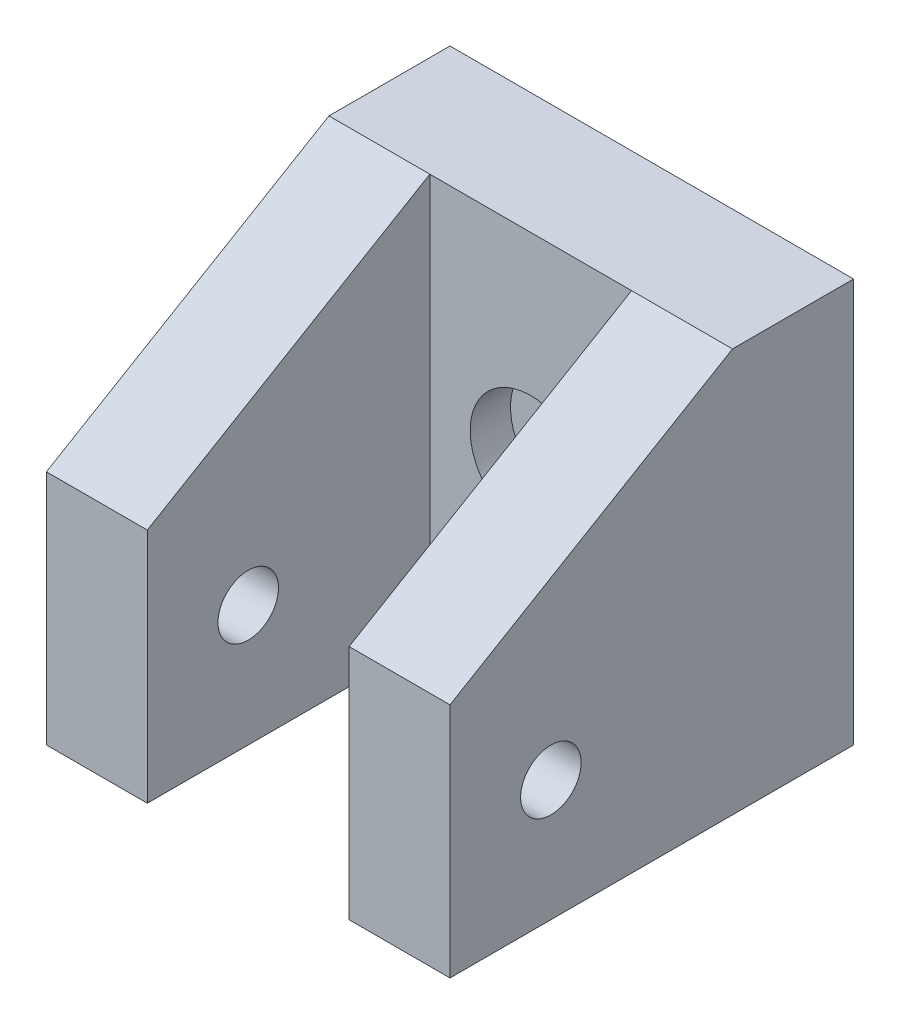
ISO-10303-21;
HEADER;
FILE_DESCRIPTION(('STEP AP214'),'2;1');
FILE_NAME('part.step','',(''),(''),'','','');
FILE_SCHEMA(('AUTOMOTIVE_DESIGN { 1 0 10303 214 1 1 1 1 }'));
ENDSEC;
DATA;
#1=APPLICATION_CONTEXT('core data for automotive mechanical design processes');
#2=APPLICATION_PROTOCOL_DEFINITION('international standard','automotive_design',2000,#1);
#3=PRODUCT_CONTEXT('',#1,'mechanical');
#4=PRODUCT('Part','Part','',(#3));
#5=PRODUCT_RELATED_PRODUCT_CATEGORY('part','',(#4));
#6=PRODUCT_DEFINITION_FORMATION('','',#4);
#7=PRODUCT_DEFINITION_CONTEXT('part definition',#1,'design');
#8=PRODUCT_DEFINITION('design','',#6,#7);
#9=PRODUCT_DEFINITION_SHAPE('','',#8);
#10=(LENGTH_UNIT() NAMED_UNIT(*) SI_UNIT(.MILLI.,.METRE.));
#11=(NAMED_UNIT(*) PLANE_ANGLE_UNIT() SI_UNIT($,.RADIAN.));
#12=(NAMED_UNIT(*) SI_UNIT($,.STERADIAN.) SOLID_ANGLE_UNIT());
#13=UNCERTAINTY_MEASURE_WITH_UNIT(LENGTH_MEASURE(1.E-05),#10,'distance_accuracy_value','');
#14=(GEOMETRIC_REPRESENTATION_CONTEXT(3) GLOBAL_UNCERTAINTY_ASSIGNED_CONTEXT((#13)) GLOBAL_UNIT_ASSIGNED_CONTEXT((#10,
#11,#12)) REPRESENTATION_CONTEXT('',''));
#15=CARTESIAN_POINT('',(0.,0.,0.));
#16=DIRECTION('',(0.,0.,1.));
#17=DIRECTION('',(1.,0.,0.));
#18=AXIS2_PLACEMENT_3D('',#15,#16,#17);
#19=CARTESIAN_POINT('',(10.,10.,0.));
#20=DIRECTION('',(0.,0.,1.));
#21=DIRECTION('',(1.,0.,0.));
#22=AXIS2_PLACEMENT_3D('',#19,#20,#21);
#23=CYLINDRICAL_SURFACE('',#22,1.6);
#24=CARTESIAN_POINT('',(10.,10.,0.));
#25=DIRECTION('',(0.,0.,1.));
#26=DIRECTION('',(1.,0.,0.));
#27=AXIS2_PLACEMENT_3D('',#24,#25,#26);
#28=CIRCLE('',#27,1.6);
#29=CARTESIAN_POINT('',(11.6,10.,0.));
#30=VERTEX_POINT('',#29);
#31=EDGE_CURVE('E156',#30,#30,#28,.T.);
#32=ORIENTED_EDGE('',*,*,#31,.F.);
#33=EDGE_LOOP('',(#32));
#34=FACE_BOUND('',#33,.T.);
#35=CARTESIAN_POINT('',(10.,10.,4.));
#36=DIRECTION('',(0.,0.,1.));
#37=DIRECTION('',(1.,0.,0.));
#38=AXIS2_PLACEMENT_3D('',#35,#36,#37);
#39=CIRCLE('',#38,1.6);
#40=CARTESIAN_POINT('',(11.6,10.,4.));
#41=VERTEX_POINT('',#40);
#42=EDGE_CURVE('E154',#41,#41,#39,.F.);
#43=ORIENTED_EDGE('',*,*,#42,.F.);
#44=EDGE_LOOP('',(#43));
#45=FACE_BOUND('',#44,.T.);
#46=ADVANCED_FACE('F35',(#34,#45),#23,.F.);
#47=CARTESIAN_POINT('',(0.,0.,20.));
#48=DIRECTION('',(0.,0.,-1.));
#49=DIRECTION('',(-1.,0.,0.));
#50=AXIS2_PLACEMENT_3D('',#47,#48,#49);
#51=PLANE('',#50);
#52=DIRECTION('',(0.,-1.,0.));
#53=VECTOR('',#52,1.);
#54=CARTESIAN_POINT('',(5.,20.,20.));
#55=LINE('',#54,#53);
#56=CARTESIAN_POINT('',(5.,11.7258345510811,20.));
#57=VERTEX_POINT('',#56);
#58=CARTESIAN_POINT('',(5.,0.,20.));
#59=VERTEX_POINT('',#58);
#60=EDGE_CURVE('E123',#57,#59,#55,.T.);
#61=ORIENTED_EDGE('',*,*,#60,.F.);
#62=DIRECTION('',(1.,0.,0.));
#63=VECTOR('',#62,1.);
#64=CARTESIAN_POINT('',(0.,11.7258345510811,20.));
#65=LINE('',#64,#63);
#66=CARTESIAN_POINT('',(0.,11.7258345510811,20.));
#67=VERTEX_POINT('',#66);
#68=EDGE_CURVE('E52',#67,#57,#65,.T.);
#69=ORIENTED_EDGE('',*,*,#68,.F.);
#70=DIRECTION('',(0.,-1.,0.));
#71=VECTOR('',#70,1.);
#72=CARTESIAN_POINT('',(0.,0.,20.));
#73=LINE('',#72,#71);
#74=CARTESIAN_POINT('',(0.,0.,20.));
#75=VERTEX_POINT('',#74);
#76=EDGE_CURVE('E121',#67,#75,#73,.T.);
#77=ORIENTED_EDGE('',*,*,#76,.T.);
#78=DIRECTION('',(1.,0.,0.));
#79=VECTOR('',#78,1.);
#80=CARTESIAN_POINT('',(0.,0.,20.));
#81=LINE('',#80,#79);
#82=EDGE_CURVE('E131',#75,#59,#81,.T.);
#83=ORIENTED_EDGE('',*,*,#82,.T.);
#84=EDGE_LOOP('',(#61,#69,#77,#83));
#85=FACE_BOUND('',#84,.T.);
#86=ADVANCED_FACE('F119',(#85),#51,.F.);
#87=CARTESIAN_POINT('',(0.,0.,20.));
#88=DIRECTION('',(1.,0.,0.));
#89=DIRECTION('',(0.,0.,-1.));
#90=AXIS2_PLACEMENT_3D('',#87,#88,#89);
#91=PLANE('',#90);
#92=CARTESIAN_POINT('',(0.,6.,15.));
#93=DIRECTION('',(1.,0.,0.));
#94=DIRECTION('',(0.,0.,-1.));
#95=AXIS2_PLACEMENT_3D('',#92,#93,#94);
#96=CIRCLE('',#95,1.5);
#97=CARTESIAN_POINT('',(0.,6.,13.5));
#98=VERTEX_POINT('',#97);
#99=EDGE_CURVE('E210',#98,#98,#96,.T.);
#100=ORIENTED_EDGE('',*,*,#99,.T.);
#101=EDGE_LOOP('',(#100));
#102=FACE_BOUND('',#101,.T.);
#103=ORIENTED_EDGE('',*,*,#76,.F.);
#104=DIRECTION('',(0.,0.50879485915685,-0.860887792511638));
#105=VECTOR('',#104,1.);
#106=CARTESIAN_POINT('',(0.,20.,6.));
#107=LINE('',#106,#105);
#108=CARTESIAN_POINT('',(0.,20.,6.));
#109=VERTEX_POINT('',#108);
#110=EDGE_CURVE('E107',#67,#109,#107,.T.);
#111=ORIENTED_EDGE('',*,*,#110,.T.);
#112=DIRECTION('',(0.,0.,-1.));
#113=VECTOR('',#112,1.);
#114=CARTESIAN_POINT('',(0.,20.,20.));
#115=LINE('',#114,#113);
#116=CARTESIAN_POINT('',(0.,20.,0.));
#117=VERTEX_POINT('',#116);
#118=EDGE_CURVE('E143',#109,#117,#115,.T.);
#119=ORIENTED_EDGE('',*,*,#118,.T.);
#120=DIRECTION('',(0.,-1.,0.));
#121=VECTOR('',#120,1.);
#122=CARTESIAN_POINT('',(0.,0.,0.));
#123=LINE('',#122,#121);
#124=CARTESIAN_POINT('',(0.,0.,0.));
#125=VERTEX_POINT('',#124);
#126=EDGE_CURVE('E144',#117,#125,#123,.T.);
#127=ORIENTED_EDGE('',*,*,#126,.T.);
#128=DIRECTION('',(0.,0.,-1.));
#129=VECTOR('',#128,1.);
#130=CARTESIAN_POINT('',(0.,0.,20.));
#131=LINE('',#130,#129);
#132=EDGE_CURVE('E11',#75,#125,#131,.T.);
#133=ORIENTED_EDGE('',*,*,#132,.F.);
#134=EDGE_LOOP('',(#103,#111,#119,#127,#133));
#135=FACE_BOUND('',#134,.T.);
#136=ADVANCED_FACE('F37',(#102,#135),#91,.F.);
#137=CARTESIAN_POINT('',(0.,0.,20.));
#138=DIRECTION('',(0.,1.,0.));
#139=DIRECTION('',(0.,0.,1.));
#140=AXIS2_PLACEMENT_3D('',#137,#138,#139);
#141=PLANE('',#140);
#142=DIRECTION('',(1.,0.,0.));
#143=VECTOR('',#142,1.);
#144=CARTESIAN_POINT('',(5.,0.,6.));
#145=LINE('',#144,#143);
#146=CARTESIAN_POINT('',(5.,0.,6.));
#147=VERTEX_POINT('',#146);
#148=CARTESIAN_POINT('',(15.,0.,6.));
#149=VERTEX_POINT('',#148);
#150=EDGE_CURVE('E176',#147,#149,#145,.T.);
#151=ORIENTED_EDGE('',*,*,#150,.F.);
#152=DIRECTION('',(0.,0.,1.));
#153=VECTOR('',#152,1.);
#154=CARTESIAN_POINT('',(5.,0.,6.));
#155=LINE('',#154,#153);
#156=EDGE_CURVE('E137',#147,#59,#155,.T.);
#157=ORIENTED_EDGE('',*,*,#156,.T.);
#158=ORIENTED_EDGE('',*,*,#82,.F.);
#159=ORIENTED_EDGE('',*,*,#132,.T.);
#160=DIRECTION('',(1.,0.,0.));
#161=VECTOR('',#160,1.);
#162=CARTESIAN_POINT('',(0.,0.,0.));
#163=LINE('',#162,#161);
#164=CARTESIAN_POINT('',(20.,0.,0.));
#165=VERTEX_POINT('',#164);
#166=EDGE_CURVE('E146',#125,#165,#163,.T.);
#167=ORIENTED_EDGE('',*,*,#166,.T.);
#168=DIRECTION('',(0.,0.,-1.));
#169=VECTOR('',#168,1.);
#170=CARTESIAN_POINT('',(20.,0.,20.));
#171=LINE('',#170,#169);
#172=CARTESIAN_POINT('',(20.,0.,20.));
#173=VERTEX_POINT('',#172);
#174=EDGE_CURVE('E44',#173,#165,#171,.T.);
#175=ORIENTED_EDGE('',*,*,#174,.F.);
#176=CARTESIAN_POINT('',(15.,0.,20.));
#177=VERTEX_POINT('',#176);
#178=EDGE_CURVE('E128',#177,#173,#81,.T.);
#179=ORIENTED_EDGE('',*,*,#178,.F.);
#180=DIRECTION('',(0.,0.,1.));
#181=VECTOR('',#180,1.);
#182=CARTESIAN_POINT('',(15.,0.,6.));
#183=LINE('',#182,#181);
#184=EDGE_CURVE('E60',#149,#177,#183,.T.);
#185=ORIENTED_EDGE('',*,*,#184,.F.);
#186=EDGE_LOOP('',(#151,#157,#158,#159,#167,#175,#179,#185));
#187=FACE_BOUND('',#186,.T.);
#188=ADVANCED_FACE('F190',(#187),#141,.F.);
#189=CARTESIAN_POINT('',(20.,0.,20.));
#190=DIRECTION('',(-1.,0.,0.));
#191=DIRECTION('',(0.,0.,1.));
#192=AXIS2_PLACEMENT_3D('',#189,#190,#191);
#193=PLANE('',#192);
#194=CARTESIAN_POINT('',(20.,6.,15.));
#195=DIRECTION('',(1.,0.,0.));
#196=DIRECTION('',(0.,0.,-1.));
#197=AXIS2_PLACEMENT_3D('',#194,#195,#196);
#198=CIRCLE('',#197,1.5);
#199=CARTESIAN_POINT('',(20.,6.,13.5));
#200=VERTEX_POINT('',#199);
#201=EDGE_CURVE('E209',#200,#200,#198,.T.);
#202=ORIENTED_EDGE('',*,*,#201,.F.);
#203=EDGE_LOOP('',(#202));
#204=FACE_BOUND('',#203,.T.);
#205=DIRECTION('',(0.,0.,-1.));
#206=VECTOR('',#205,1.);
#207=CARTESIAN_POINT('',(20.,20.,20.));
#208=LINE('',#207,#206);
#209=CARTESIAN_POINT('',(20.,20.,6.));
#210=VERTEX_POINT('',#209);
#211=CARTESIAN_POINT('',(20.,20.,0.));
#212=VERTEX_POINT('',#211);
#213=EDGE_CURVE('E151',#210,#212,#208,.T.);
#214=ORIENTED_EDGE('',*,*,#213,.F.);
#215=DIRECTION('',(0.,0.50879485915685,-0.860887792511638));
#216=VECTOR('',#215,1.);
#217=CARTESIAN_POINT('',(20.,20.,6.));
#218=LINE('',#217,#216);
#219=CARTESIAN_POINT('',(20.,11.7258345510811,20.));
#220=VERTEX_POINT('',#219);
#221=EDGE_CURVE('E115',#220,#210,#218,.T.);
#222=ORIENTED_EDGE('',*,*,#221,.F.);
#223=DIRECTION('',(0.,1.,0.));
#224=VECTOR('',#223,1.);
#225=CARTESIAN_POINT('',(20.,0.,20.));
#226=LINE('',#225,#224);
#227=EDGE_CURVE('E140',#173,#220,#226,.T.);
#228=ORIENTED_EDGE('',*,*,#227,.F.);
#229=ORIENTED_EDGE('',*,*,#174,.T.);
#230=DIRECTION('',(0.,1.,0.));
#231=VECTOR('',#230,1.);
#232=CARTESIAN_POINT('',(20.,0.,0.));
#233=LINE('',#232,#231);
#234=EDGE_CURVE('E134',#165,#212,#233,.T.);
#235=ORIENTED_EDGE('',*,*,#234,.T.);
#236=EDGE_LOOP('',(#214,#222,#228,#229,#235));
#237=FACE_BOUND('',#236,.T.);
#238=ADVANCED_FACE('F218',(#204,#237),#193,.F.);
#239=CARTESIAN_POINT('',(0.,20.,20.));
#240=DIRECTION('',(0.,-1.,0.));
#241=DIRECTION('',(0.,0.,-1.));
#242=AXIS2_PLACEMENT_3D('',#239,#240,#241);
#243=PLANE('',#242);
#244=ORIENTED_EDGE('',*,*,#118,.F.);
#245=DIRECTION('',(1.,0.,0.));
#246=VECTOR('',#245,1.);
#247=CARTESIAN_POINT('',(0.,20.,6.));
#248=LINE('',#247,#246);
#249=CARTESIAN_POINT('',(5.,20.,6.));
#250=VERTEX_POINT('',#249);
#251=EDGE_CURVE('E110',#109,#250,#248,.T.);
#252=ORIENTED_EDGE('',*,*,#251,.T.);
#253=DIRECTION('',(-1.,0.,0.));
#254=VECTOR('',#253,1.);
#255=CARTESIAN_POINT('',(5.,20.,6.));
#256=LINE('',#255,#254);
#257=CARTESIAN_POINT('',(15.,20.,6.));
#258=VERTEX_POINT('',#257);
#259=EDGE_CURVE('E183',#258,#250,#256,.T.);
#260=ORIENTED_EDGE('',*,*,#259,.F.);
#261=EDGE_CURVE('E124',#258,#210,#248,.T.);
#262=ORIENTED_EDGE('',*,*,#261,.T.);
#263=ORIENTED_EDGE('',*,*,#213,.T.);
#264=DIRECTION('',(-1.,0.,0.));
#265=VECTOR('',#264,1.);
#266=CARTESIAN_POINT('',(0.,20.,0.));
#267=LINE('',#266,#265);
#268=EDGE_CURVE('E129',#212,#117,#267,.T.);
#269=ORIENTED_EDGE('',*,*,#268,.T.);
#270=EDGE_LOOP('',(#244,#252,#260,#262,#263,#269));
#271=FACE_BOUND('',#270,.T.);
#272=ADVANCED_FACE('F199',(#271),#243,.F.);
#273=ORIENTED_EDGE('',*,*,#227,.T.);
#274=CARTESIAN_POINT('',(15.,11.7258345510811,20.));
#275=VERTEX_POINT('',#274);
#276=EDGE_CURVE('E114',#275,#220,#65,.T.);
#277=ORIENTED_EDGE('',*,*,#276,.F.);
#278=DIRECTION('',(0.,1.,0.));
#279=VECTOR('',#278,1.);
#280=CARTESIAN_POINT('',(15.,20.,20.));
#281=LINE('',#280,#279);
#282=EDGE_CURVE('E177',#177,#275,#281,.T.);
#283=ORIENTED_EDGE('',*,*,#282,.F.);
#284=ORIENTED_EDGE('',*,*,#178,.T.);
#285=EDGE_LOOP('',(#273,#277,#283,#284));
#286=FACE_BOUND('',#285,.T.);
#287=ADVANCED_FACE('F233',(#286),#51,.F.);
#288=CARTESIAN_POINT('',(0.,0.,0.));
#289=DIRECTION('',(0.,0.,-1.));
#290=DIRECTION('',(-1.,0.,0.));
#291=AXIS2_PLACEMENT_3D('',#288,#289,#290);
#292=PLANE('',#291);
#293=ORIENTED_EDGE('',*,*,#31,.T.);
#294=EDGE_LOOP('',(#293));
#295=FACE_BOUND('',#294,.T.);
#296=ORIENTED_EDGE('',*,*,#126,.F.);
#297=ORIENTED_EDGE('',*,*,#268,.F.);
#298=ORIENTED_EDGE('',*,*,#234,.F.);
#299=ORIENTED_EDGE('',*,*,#166,.F.);
#300=EDGE_LOOP('',(#296,#297,#298,#299));
#301=FACE_BOUND('',#300,.T.);
#302=ADVANCED_FACE('F228',(#295,#301),#292,.T.);
#303=CARTESIAN_POINT('',(5.,20.,6.));
#304=DIRECTION('',(-1.,0.,0.));
#305=DIRECTION('',(0.,-1.,0.));
#306=AXIS2_PLACEMENT_3D('',#303,#304,#305);
#307=PLANE('',#306);
#308=CARTESIAN_POINT('',(5.,6.,15.));
#309=DIRECTION('',(-1.,0.,0.));
#310=DIRECTION('',(0.,-1.,0.));
#311=AXIS2_PLACEMENT_3D('',#308,#309,#310);
#312=CIRCLE('',#311,1.5);
#313=CARTESIAN_POINT('',(5.,4.5,15.));
#314=VERTEX_POINT('',#313);
#315=EDGE_CURVE('E168',#314,#314,#312,.T.);
#316=ORIENTED_EDGE('',*,*,#315,.T.);
#317=EDGE_LOOP('',(#316));
#318=FACE_BOUND('',#317,.T.);
#319=DIRECTION('',(0.,-1.,0.));
#320=VECTOR('',#319,1.);
#321=CARTESIAN_POINT('',(5.,20.,6.));
#322=LINE('',#321,#320);
#323=EDGE_CURVE('E173',#250,#147,#322,.T.);
#324=ORIENTED_EDGE('',*,*,#323,.F.);
#325=DIRECTION('',(0.,-0.50879485915685,0.860887792511638));
#326=VECTOR('',#325,1.);
#327=CARTESIAN_POINT('',(5.,20.,6.));
#328=LINE('',#327,#326);
#329=EDGE_CURVE('E204',#250,#57,#328,.T.);
#330=ORIENTED_EDGE('',*,*,#329,.T.);
#331=ORIENTED_EDGE('',*,*,#60,.T.);
#332=ORIENTED_EDGE('',*,*,#156,.F.);
#333=EDGE_LOOP('',(#324,#330,#331,#332));
#334=FACE_BOUND('',#333,.T.);
#335=ADVANCED_FACE('F193',(#318,#334),#307,.F.);
#336=CARTESIAN_POINT('',(15.,20.,6.));
#337=DIRECTION('',(1.,0.,0.));
#338=DIRECTION('',(0.,1.,0.));
#339=AXIS2_PLACEMENT_3D('',#336,#337,#338);
#340=PLANE('',#339);
#341=CARTESIAN_POINT('',(15.,6.,15.));
#342=DIRECTION('',(1.,0.,0.));
#343=DIRECTION('',(0.,1.,0.));
#344=AXIS2_PLACEMENT_3D('',#341,#342,#343);
#345=CIRCLE('',#344,1.5);
#346=CARTESIAN_POINT('',(15.,7.5,15.));
#347=VERTEX_POINT('',#346);
#348=EDGE_CURVE('E39',#347,#347,#345,.T.);
#349=ORIENTED_EDGE('',*,*,#348,.T.);
#350=EDGE_LOOP('',(#349));
#351=FACE_BOUND('',#350,.T.);
#352=ORIENTED_EDGE('',*,*,#282,.T.);
#353=DIRECTION('',(0.,0.50879485915685,-0.860887792511638));
#354=VECTOR('',#353,1.);
#355=CARTESIAN_POINT('',(15.,20.,6.));
#356=LINE('',#355,#354);
#357=EDGE_CURVE('E201',#275,#258,#356,.T.);
#358=ORIENTED_EDGE('',*,*,#357,.T.);
#359=DIRECTION('',(0.,1.,0.));
#360=VECTOR('',#359,1.);
#361=CARTESIAN_POINT('',(15.,20.,6.));
#362=LINE('',#361,#360);
#363=EDGE_CURVE('E180',#149,#258,#362,.T.);
#364=ORIENTED_EDGE('',*,*,#363,.F.);
#365=ORIENTED_EDGE('',*,*,#184,.T.);
#366=EDGE_LOOP('',(#352,#358,#364,#365));
#367=FACE_BOUND('',#366,.T.);
#368=ADVANCED_FACE('F234',(#351,#367),#340,.F.);
#369=CARTESIAN_POINT('',(0.,0.,6.));
#370=DIRECTION('',(0.,0.,1.));
#371=DIRECTION('',(1.,0.,0.));
#372=AXIS2_PLACEMENT_3D('',#369,#370,#371);
#373=PLANE('',#372);
#374=CARTESIAN_POINT('',(10.,10.,6.));
#375=DIRECTION('',(0.,0.,1.));
#376=DIRECTION('',(1.,0.,0.));
#377=AXIS2_PLACEMENT_3D('',#374,#375,#376);
#378=CIRCLE('',#377,3.);
#379=CARTESIAN_POINT('',(13.,10.,6.));
#380=VERTEX_POINT('',#379);
#381=EDGE_CURVE('E163',#380,#380,#378,.T.);
#382=ORIENTED_EDGE('',*,*,#381,.F.);
#383=EDGE_LOOP('',(#382));
#384=FACE_BOUND('',#383,.T.);
#385=ORIENTED_EDGE('',*,*,#323,.T.);
#386=ORIENTED_EDGE('',*,*,#150,.T.);
#387=ORIENTED_EDGE('',*,*,#363,.T.);
#388=ORIENTED_EDGE('',*,*,#259,.T.);
#389=EDGE_LOOP('',(#385,#386,#387,#388));
#390=FACE_BOUND('',#389,.T.);
#391=ADVANCED_FACE('F195',(#384,#390),#373,.T.);
#392=CARTESIAN_POINT('',(10.,10.,4.));
#393=DIRECTION('',(0.,0.,1.));
#394=DIRECTION('',(1.,0.,0.));
#395=AXIS2_PLACEMENT_3D('',#392,#393,#394);
#396=PLANE('',#395);
#397=CARTESIAN_POINT('',(10.,10.,4.));
#398=DIRECTION('',(0.,0.,1.));
#399=DIRECTION('',(1.,0.,0.));
#400=AXIS2_PLACEMENT_3D('',#397,#398,#399);
#401=CIRCLE('',#400,3.);
#402=CARTESIAN_POINT('',(13.,10.,4.));
#403=VERTEX_POINT('',#402);
#404=EDGE_CURVE('E157',#403,#403,#401,.T.);
#405=ORIENTED_EDGE('',*,*,#404,.T.);
#406=EDGE_LOOP('',(#405));
#407=FACE_BOUND('',#406,.T.);
#408=ORIENTED_EDGE('',*,*,#42,.T.);
#409=EDGE_LOOP('',(#408));
#410=FACE_BOUND('',#409,.T.);
#411=ADVANCED_FACE('F261',(#407,#410),#396,.T.);
#412=CARTESIAN_POINT('',(10.,10.,4.));
#413=DIRECTION('',(0.,0.,1.));
#414=DIRECTION('',(1.,0.,0.));
#415=AXIS2_PLACEMENT_3D('',#412,#413,#414);
#416=CYLINDRICAL_SURFACE('',#415,3.);
#417=ORIENTED_EDGE('',*,*,#404,.F.);
#418=EDGE_LOOP('',(#417));
#419=FACE_BOUND('',#418,.T.);
#420=ORIENTED_EDGE('',*,*,#381,.T.);
#421=EDGE_LOOP('',(#420));
#422=FACE_BOUND('',#421,.T.);
#423=ADVANCED_FACE('F257',(#419,#422),#416,.F.);
#424=CARTESIAN_POINT('',(0.,6.,15.));
#425=DIRECTION('',(1.,0.,0.));
#426=DIRECTION('',(0.,0.,-1.));
#427=AXIS2_PLACEMENT_3D('',#424,#425,#426);
#428=CYLINDRICAL_SURFACE('',#427,1.5);
#429=ORIENTED_EDGE('',*,*,#201,.T.);
#430=EDGE_LOOP('',(#429));
#431=FACE_BOUND('',#430,.T.);
#432=ORIENTED_EDGE('',*,*,#348,.F.);
#433=EDGE_LOOP('',(#432));
#434=FACE_BOUND('',#433,.T.);
#435=ADVANCED_FACE('F215',(#431,#434),#428,.F.);
#436=ORIENTED_EDGE('',*,*,#99,.F.);
#437=EDGE_LOOP('',(#436));
#438=FACE_BOUND('',#437,.T.);
#439=ORIENTED_EDGE('',*,*,#315,.F.);
#440=EDGE_LOOP('',(#439));
#441=FACE_BOUND('',#440,.T.);
#442=ADVANCED_FACE('F238',(#438,#441),#428,.F.);
#443=CARTESIAN_POINT('',(0.,20.,6.));
#444=DIRECTION('',(0.,-0.860887792511638,-0.50879485915685));
#445=DIRECTION('',(0.,0.50879485915685,-0.860887792511638));
#446=AXIS2_PLACEMENT_3D('',#443,#444,#445);
#447=PLANE('',#446);
#448=ORIENTED_EDGE('',*,*,#276,.T.);
#449=ORIENTED_EDGE('',*,*,#221,.T.);
#450=ORIENTED_EDGE('',*,*,#261,.F.);
#451=ORIENTED_EDGE('',*,*,#357,.F.);
#452=EDGE_LOOP('',(#448,#449,#450,#451));
#453=FACE_BOUND('',#452,.T.);
#454=ADVANCED_FACE('F236',(#453),#447,.F.);
#455=ORIENTED_EDGE('',*,*,#251,.F.);
#456=ORIENTED_EDGE('',*,*,#110,.F.);
#457=ORIENTED_EDGE('',*,*,#68,.T.);
#458=ORIENTED_EDGE('',*,*,#329,.F.);
#459=EDGE_LOOP('',(#455,#456,#457,#458));
#460=FACE_BOUND('',#459,.T.);
#461=ADVANCED_FACE('F108',(#460),#447,.F.);
#462=CLOSED_SHELL('',(#46,#86,#136,#188,#238,#272,#287,#302,#335,#368,#391,#411,#423,#435,#442,
#454,#461));
#463=MANIFOLD_SOLID_BREP('B2',#462);
#464=ADVANCED_BREP_SHAPE_REPRESENTATION('',(#18,#463),#14);
#465=SHAPE_DEFINITION_REPRESENTATION(#9,#464);
ENDSEC;
END-ISO-10303-21;
